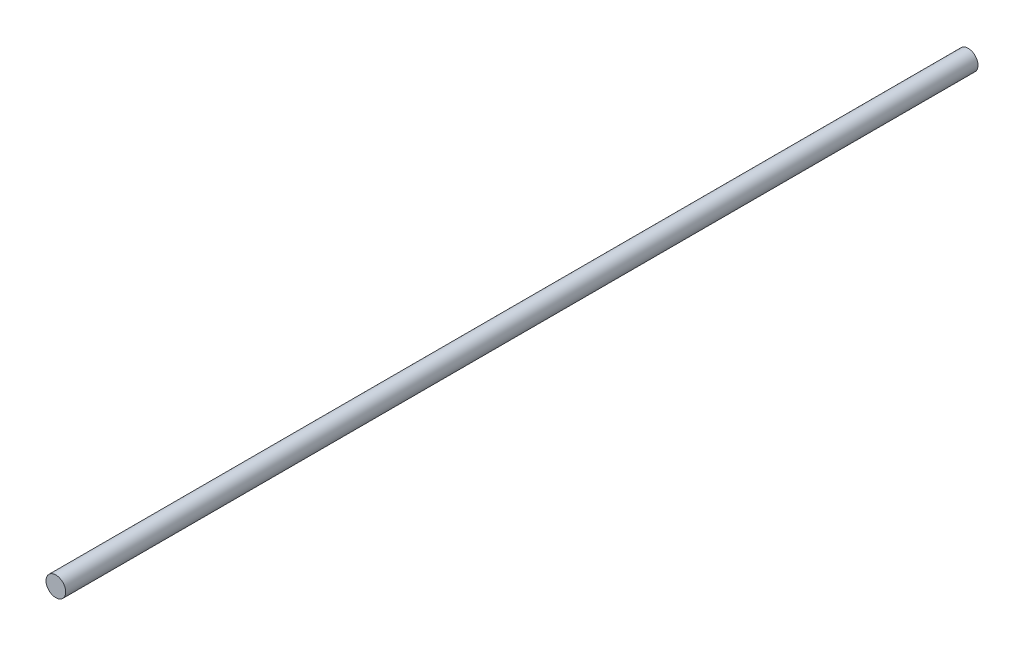
ISO-10303-21;
HEADER;
FILE_DESCRIPTION(('STEP AP214'),'2;1');
FILE_NAME('part.step','',(''),(''),'','','');
FILE_SCHEMA(('AUTOMOTIVE_DESIGN { 1 0 10303 214 1 1 1 1 }'));
ENDSEC;
DATA;
#1=APPLICATION_CONTEXT('core data for automotive mechanical design processes');
#2=APPLICATION_PROTOCOL_DEFINITION('international standard','automotive_design',2000,#1);
#3=PRODUCT_CONTEXT('',#1,'mechanical');
#4=PRODUCT('Part','Part','',(#3));
#5=PRODUCT_RELATED_PRODUCT_CATEGORY('part','',(#4));
#6=PRODUCT_DEFINITION_FORMATION('','',#4);
#7=PRODUCT_DEFINITION_CONTEXT('part definition',#1,'design');
#8=PRODUCT_DEFINITION('design','',#6,#7);
#9=PRODUCT_DEFINITION_SHAPE('','',#8);
#10=(LENGTH_UNIT() NAMED_UNIT(*) SI_UNIT(.MILLI.,.METRE.));
#11=(NAMED_UNIT(*) PLANE_ANGLE_UNIT() SI_UNIT($,.RADIAN.));
#12=(NAMED_UNIT(*) SI_UNIT($,.STERADIAN.) SOLID_ANGLE_UNIT());
#13=UNCERTAINTY_MEASURE_WITH_UNIT(LENGTH_MEASURE(1.E-05),#10,'distance_accuracy_value','');
#14=(GEOMETRIC_REPRESENTATION_CONTEXT(3) GLOBAL_UNCERTAINTY_ASSIGNED_CONTEXT((#13)) GLOBAL_UNIT_ASSIGNED_CONTEXT((#10,
#11,#12)) REPRESENTATION_CONTEXT('',''));
#15=CARTESIAN_POINT('',(0.,0.,0.));
#16=DIRECTION('',(0.,0.,1.));
#17=DIRECTION('',(1.,0.,0.));
#18=AXIS2_PLACEMENT_3D('',#15,#16,#17);
#19=CARTESIAN_POINT('',(0.,0.,0.));
#20=DIRECTION('',(0.,0.,1.));
#21=DIRECTION('',(1.,0.,0.));
#22=AXIS2_PLACEMENT_3D('',#19,#20,#21);
#23=PLANE('',#22);
#24=CARTESIAN_POINT('',(0.,0.,0.));
#25=DIRECTION('',(0.,0.,1.));
#26=DIRECTION('',(1.,0.,0.));
#27=AXIS2_PLACEMENT_3D('',#24,#25,#26);
#28=CIRCLE('',#27,0.27);
#29=CARTESIAN_POINT('',(-0.27,0.,0.));
#30=VERTEX_POINT('',#29);
#31=EDGE_CURVE('E11',#30,#30,#28,.T.);
#32=ORIENTED_EDGE('',*,*,#31,.F.);
#33=EDGE_LOOP('',(#32));
#34=FACE_BOUND('',#33,.T.);
#35=ADVANCED_FACE('F16',(#34),#23,.F.);
#36=CARTESIAN_POINT('',(0.,0.,25.));
#37=DIRECTION('',(0.,0.,1.));
#38=DIRECTION('',(1.,0.,0.));
#39=AXIS2_PLACEMENT_3D('',#36,#37,#38);
#40=PLANE('',#39);
#41=CARTESIAN_POINT('',(0.,0.,25.));
#42=DIRECTION('',(0.,0.,1.));
#43=DIRECTION('',(1.,0.,0.));
#44=AXIS2_PLACEMENT_3D('',#41,#42,#43);
#45=CIRCLE('',#44,0.27);
#46=CARTESIAN_POINT('',(-0.27,0.,25.));
#47=VERTEX_POINT('',#46);
#48=EDGE_CURVE('E41',#47,#47,#45,.T.);
#49=ORIENTED_EDGE('',*,*,#48,.T.);
#50=EDGE_LOOP('',(#49));
#51=FACE_BOUND('',#50,.T.);
#52=ADVANCED_FACE('F18',(#51),#40,.T.);
#53=CARTESIAN_POINT('',(0.,0.,0.));
#54=DIRECTION('',(0.,0.,1.));
#55=DIRECTION('',(1.,0.,0.));
#56=AXIS2_PLACEMENT_3D('',#53,#54,#55);
#57=CYLINDRICAL_SURFACE('',#56,0.27);
#58=ORIENTED_EDGE('',*,*,#48,.F.);
#59=DIRECTION('',(0.,0.,-1.));
#60=VECTOR('',#59,1.);
#61=CARTESIAN_POINT('',(-0.27,0.,0.));
#62=LINE('',#61,#60);
#63=EDGE_CURVE('E20',#47,#30,#62,.T.);
#64=ORIENTED_EDGE('',*,*,#63,.T.);
#65=ORIENTED_EDGE('',*,*,#31,.T.);
#66=ORIENTED_EDGE('',*,*,#63,.F.);
#67=EDGE_LOOP('',(#58,#64,#65,#66));
#68=FACE_BOUND('',#67,.T.);
#69=ADVANCED_FACE('F40',(#68),#57,.T.);
#70=CLOSED_SHELL('',(#35,#52,#69));
#71=MANIFOLD_SOLID_BREP('B1',#70);
#72=ADVANCED_BREP_SHAPE_REPRESENTATION('',(#18,#71),#14);
#73=SHAPE_DEFINITION_REPRESENTATION(#9,#72);
ENDSEC;
END-ISO-10303-21;
